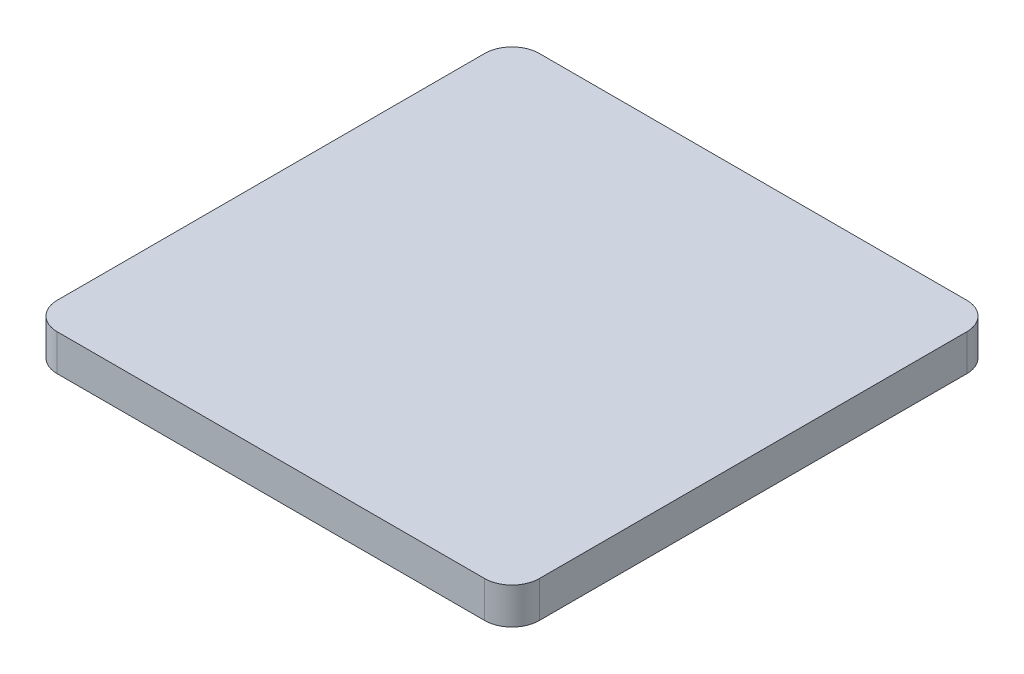
ISO-10303-21;
HEADER;
FILE_DESCRIPTION(('STEP AP214'),'2;1');
FILE_NAME('part.step','',(''),(''),'','','');
FILE_SCHEMA(('AUTOMOTIVE_DESIGN { 1 0 10303 214 1 1 1 1 }'));
ENDSEC;
DATA;
#1=APPLICATION_CONTEXT('core data for automotive mechanical design processes');
#2=APPLICATION_PROTOCOL_DEFINITION('international standard','automotive_design',2000,#1);
#3=PRODUCT_CONTEXT('',#1,'mechanical');
#4=PRODUCT('Part','Part','',(#3));
#5=PRODUCT_RELATED_PRODUCT_CATEGORY('part','',(#4));
#6=PRODUCT_DEFINITION_FORMATION('','',#4);
#7=PRODUCT_DEFINITION_CONTEXT('part definition',#1,'design');
#8=PRODUCT_DEFINITION('design','',#6,#7);
#9=PRODUCT_DEFINITION_SHAPE('','',#8);
#10=(LENGTH_UNIT() NAMED_UNIT(*) SI_UNIT(.MILLI.,.METRE.));
#11=(NAMED_UNIT(*) PLANE_ANGLE_UNIT() SI_UNIT($,.RADIAN.));
#12=(NAMED_UNIT(*) SI_UNIT($,.STERADIAN.) SOLID_ANGLE_UNIT());
#13=UNCERTAINTY_MEASURE_WITH_UNIT(LENGTH_MEASURE(1.E-05),#10,'distance_accuracy_value','');
#14=(GEOMETRIC_REPRESENTATION_CONTEXT(3) GLOBAL_UNCERTAINTY_ASSIGNED_CONTEXT((#13)) GLOBAL_UNIT_ASSIGNED_CONTEXT((#10,
#11,#12)) REPRESENTATION_CONTEXT('',''));
#15=CARTESIAN_POINT('',(0.,0.,0.));
#16=DIRECTION('',(0.,0.,1.));
#17=DIRECTION('',(1.,0.,0.));
#18=AXIS2_PLACEMENT_3D('',#15,#16,#17);
#19=CARTESIAN_POINT('',(0.,4.,0.));
#20=DIRECTION('',(1.,0.,0.));
#21=DIRECTION('',(0.,0.,-1.));
#22=AXIS2_PLACEMENT_3D('',#19,#20,#21);
#23=PLANE('',#22);
#24=DIRECTION('',(0.,0.,1.));
#25=VECTOR('',#24,1.);
#26=CARTESIAN_POINT('',(0.,4.,0.));
#27=LINE('',#26,#25);
#28=CARTESIAN_POINT('',(0.,4.,-50.));
#29=VERTEX_POINT('',#28);
#30=CARTESIAN_POINT('',(0.,4.,-3.));
#31=VERTEX_POINT('',#30);
#32=EDGE_CURVE('E118',#29,#31,#27,.T.);
#33=ORIENTED_EDGE('',*,*,#32,.F.);
#34=DIRECTION('',(0.,-1.,0.));
#35=VECTOR('',#34,1.);
#36=CARTESIAN_POINT('',(0.,4.,-50.));
#37=LINE('',#36,#35);
#38=CARTESIAN_POINT('',(0.,0.,-50.));
#39=VERTEX_POINT('',#38);
#40=EDGE_CURVE('E103',#29,#39,#37,.T.);
#41=ORIENTED_EDGE('',*,*,#40,.T.);
#42=DIRECTION('',(0.,0.,1.));
#43=VECTOR('',#42,1.);
#44=CARTESIAN_POINT('',(0.,0.,0.));
#45=LINE('',#44,#43);
#46=CARTESIAN_POINT('',(0.,0.,-3.));
#47=VERTEX_POINT('',#46);
#48=EDGE_CURVE('E115',#39,#47,#45,.T.);
#49=ORIENTED_EDGE('',*,*,#48,.T.);
#50=DIRECTION('',(0.,-1.,0.));
#51=VECTOR('',#50,1.);
#52=CARTESIAN_POINT('',(0.,4.,-3.));
#53=LINE('',#52,#51);
#54=EDGE_CURVE('E120',#47,#31,#53,.F.);
#55=ORIENTED_EDGE('',*,*,#54,.T.);
#56=EDGE_LOOP('',(#33,#41,#49,#55));
#57=FACE_BOUND('',#56,.T.);
#58=ADVANCED_FACE('F34',(#57),#23,.F.);
#59=CARTESIAN_POINT('',(0.,4.,0.));
#60=DIRECTION('',(0.,0.,-1.));
#61=DIRECTION('',(-1.,0.,0.));
#62=AXIS2_PLACEMENT_3D('',#59,#60,#61);
#63=PLANE('',#62);
#64=DIRECTION('',(1.,0.,0.));
#65=VECTOR('',#64,1.);
#66=CARTESIAN_POINT('',(0.,4.,0.));
#67=LINE('',#66,#65);
#68=CARTESIAN_POINT('',(3.,4.,0.));
#69=VERTEX_POINT('',#68);
#70=CARTESIAN_POINT('',(50.,4.,0.));
#71=VERTEX_POINT('',#70);
#72=EDGE_CURVE('E169',#69,#71,#67,.T.);
#73=ORIENTED_EDGE('',*,*,#72,.F.);
#74=DIRECTION('',(0.,-1.,0.));
#75=VECTOR('',#74,1.);
#76=CARTESIAN_POINT('',(3.,4.,0.));
#77=LINE('',#76,#75);
#78=CARTESIAN_POINT('',(3.,0.,0.));
#79=VERTEX_POINT('',#78);
#80=EDGE_CURVE('E153',#69,#79,#77,.T.);
#81=ORIENTED_EDGE('',*,*,#80,.T.);
#82=DIRECTION('',(1.,0.,0.));
#83=VECTOR('',#82,1.);
#84=CARTESIAN_POINT('',(0.,0.,0.));
#85=LINE('',#84,#83);
#86=CARTESIAN_POINT('',(50.,0.,0.));
#87=VERTEX_POINT('',#86);
#88=EDGE_CURVE('E124',#79,#87,#85,.T.);
#89=ORIENTED_EDGE('',*,*,#88,.T.);
#90=DIRECTION('',(0.,-1.,0.));
#91=VECTOR('',#90,1.);
#92=CARTESIAN_POINT('',(50.,4.,0.));
#93=LINE('',#92,#91);
#94=EDGE_CURVE('E151',#87,#71,#93,.F.);
#95=ORIENTED_EDGE('',*,*,#94,.T.);
#96=EDGE_LOOP('',(#73,#81,#89,#95));
#97=FACE_BOUND('',#96,.T.);
#98=ADVANCED_FACE('F179',(#97),#63,.F.);
#99=CARTESIAN_POINT('',(53.,4.,0.));
#100=DIRECTION('',(-1.,0.,0.));
#101=DIRECTION('',(0.,0.,1.));
#102=AXIS2_PLACEMENT_3D('',#99,#100,#101);
#103=PLANE('',#102);
#104=DIRECTION('',(0.,0.,-1.));
#105=VECTOR('',#104,1.);
#106=CARTESIAN_POINT('',(53.,0.,0.));
#107=LINE('',#106,#105);
#108=CARTESIAN_POINT('',(53.,0.,-3.));
#109=VERTEX_POINT('',#108);
#110=CARTESIAN_POINT('',(53.,0.,-50.));
#111=VERTEX_POINT('',#110);
#112=EDGE_CURVE('E127',#109,#111,#107,.T.);
#113=ORIENTED_EDGE('',*,*,#112,.T.);
#114=DIRECTION('',(0.,-1.,0.));
#115=VECTOR('',#114,1.);
#116=CARTESIAN_POINT('',(53.,4.,-50.));
#117=LINE('',#116,#115);
#118=CARTESIAN_POINT('',(53.,4.,-50.));
#119=VERTEX_POINT('',#118);
#120=EDGE_CURVE('E11',#111,#119,#117,.F.);
#121=ORIENTED_EDGE('',*,*,#120,.T.);
#122=DIRECTION('',(0.,0.,-1.));
#123=VECTOR('',#122,1.);
#124=CARTESIAN_POINT('',(53.,4.,0.));
#125=LINE('',#124,#123);
#126=CARTESIAN_POINT('',(53.,4.,-3.));
#127=VERTEX_POINT('',#126);
#128=EDGE_CURVE('E159',#127,#119,#125,.T.);
#129=ORIENTED_EDGE('',*,*,#128,.F.);
#130=DIRECTION('',(0.,-1.,0.));
#131=VECTOR('',#130,1.);
#132=CARTESIAN_POINT('',(53.,4.,-3.));
#133=LINE('',#132,#131);
#134=EDGE_CURVE('E42',#127,#109,#133,.T.);
#135=ORIENTED_EDGE('',*,*,#134,.T.);
#136=EDGE_LOOP('',(#113,#121,#129,#135));
#137=FACE_BOUND('',#136,.T.);
#138=ADVANCED_FACE('F158',(#137),#103,.F.);
#139=CARTESIAN_POINT('',(0.,4.,-53.));
#140=DIRECTION('',(0.,0.,1.));
#141=DIRECTION('',(1.,0.,0.));
#142=AXIS2_PLACEMENT_3D('',#139,#140,#141);
#143=PLANE('',#142);
#144=DIRECTION('',(-1.,0.,0.));
#145=VECTOR('',#144,1.);
#146=CARTESIAN_POINT('',(0.,0.,-53.));
#147=LINE('',#146,#145);
#148=CARTESIAN_POINT('',(50.,0.,-53.));
#149=VERTEX_POINT('',#148);
#150=CARTESIAN_POINT('',(2.99999999999999,0.,-53.));
#151=VERTEX_POINT('',#150);
#152=EDGE_CURVE('E134',#149,#151,#147,.T.);
#153=ORIENTED_EDGE('',*,*,#152,.T.);
#154=DIRECTION('',(0.,-1.,0.));
#155=VECTOR('',#154,1.);
#156=CARTESIAN_POINT('',(2.99999999999999,4.,-53.));
#157=LINE('',#156,#155);
#158=CARTESIAN_POINT('',(2.99999999999999,4.,-53.));
#159=VERTEX_POINT('',#158);
#160=EDGE_CURVE('E104',#151,#159,#157,.F.);
#161=ORIENTED_EDGE('',*,*,#160,.T.);
#162=DIRECTION('',(-1.,0.,0.));
#163=VECTOR('',#162,1.);
#164=CARTESIAN_POINT('',(0.,4.,-53.));
#165=LINE('',#164,#163);
#166=CARTESIAN_POINT('',(50.,4.,-53.));
#167=VERTEX_POINT('',#166);
#168=EDGE_CURVE('E130',#167,#159,#165,.T.);
#169=ORIENTED_EDGE('',*,*,#168,.F.);
#170=DIRECTION('',(0.,-1.,0.));
#171=VECTOR('',#170,1.);
#172=CARTESIAN_POINT('',(50.,4.,-53.));
#173=LINE('',#172,#171);
#174=EDGE_CURVE('E109',#167,#149,#173,.T.);
#175=ORIENTED_EDGE('',*,*,#174,.T.);
#176=EDGE_LOOP('',(#153,#161,#169,#175));
#177=FACE_BOUND('',#176,.T.);
#178=ADVANCED_FACE('F167',(#177),#143,.F.);
#179=CARTESIAN_POINT('',(0.,4.,0.));
#180=DIRECTION('',(0.,-1.,0.));
#181=DIRECTION('',(0.,0.,-1.));
#182=AXIS2_PLACEMENT_3D('',#179,#180,#181);
#183=PLANE('',#182);
#184=ORIENTED_EDGE('',*,*,#168,.T.);
#185=CARTESIAN_POINT('',(2.99999999999999,4.,-50.));
#186=DIRECTION('',(0.,-1.,0.));
#187=DIRECTION('',(0.,0.,-1.));
#188=AXIS2_PLACEMENT_3D('',#185,#186,#187);
#189=CIRCLE('',#188,3.);
#190=EDGE_CURVE('E149',#159,#29,#189,.F.);
#191=ORIENTED_EDGE('',*,*,#190,.T.);
#192=ORIENTED_EDGE('',*,*,#32,.T.);
#193=CARTESIAN_POINT('',(3.,4.,-3.));
#194=DIRECTION('',(0.,-1.,0.));
#195=DIRECTION('',(0.,0.,-1.));
#196=AXIS2_PLACEMENT_3D('',#193,#194,#195);
#197=CIRCLE('',#196,3.);
#198=EDGE_CURVE('E147',#31,#69,#197,.F.);
#199=ORIENTED_EDGE('',*,*,#198,.T.);
#200=ORIENTED_EDGE('',*,*,#72,.T.);
#201=CARTESIAN_POINT('',(50.,4.,-3.));
#202=DIRECTION('',(0.,-1.,0.));
#203=DIRECTION('',(0.,0.,-1.));
#204=AXIS2_PLACEMENT_3D('',#201,#202,#203);
#205=CIRCLE('',#204,3.);
#206=EDGE_CURVE('E54',#71,#127,#205,.F.);
#207=ORIENTED_EDGE('',*,*,#206,.T.);
#208=ORIENTED_EDGE('',*,*,#128,.T.);
#209=CARTESIAN_POINT('',(50.,4.,-50.));
#210=DIRECTION('',(0.,-1.,0.));
#211=DIRECTION('',(0.,0.,-1.));
#212=AXIS2_PLACEMENT_3D('',#209,#210,#211);
#213=CIRCLE('',#212,3.);
#214=EDGE_CURVE('E145',#119,#167,#213,.F.);
#215=ORIENTED_EDGE('',*,*,#214,.T.);
#216=EDGE_LOOP('',(#184,#191,#192,#199,#200,#207,#208,#215));
#217=FACE_BOUND('',#216,.T.);
#218=ADVANCED_FACE('F173',(#217),#183,.F.);
#219=CARTESIAN_POINT('',(0.,0.,0.));
#220=DIRECTION('',(0.,-1.,0.));
#221=DIRECTION('',(0.,0.,-1.));
#222=AXIS2_PLACEMENT_3D('',#219,#220,#221);
#223=PLANE('',#222);
#224=ORIENTED_EDGE('',*,*,#48,.F.);
#225=CARTESIAN_POINT('',(2.99999999999999,0.,-50.));
#226=DIRECTION('',(0.,-1.,0.));
#227=DIRECTION('',(0.,0.,-1.));
#228=AXIS2_PLACEMENT_3D('',#225,#226,#227);
#229=CIRCLE('',#228,3.);
#230=EDGE_CURVE('E99',#39,#151,#229,.T.);
#231=ORIENTED_EDGE('',*,*,#230,.T.);
#232=ORIENTED_EDGE('',*,*,#152,.F.);
#233=CARTESIAN_POINT('',(50.,0.,-50.));
#234=DIRECTION('',(0.,-1.,0.));
#235=DIRECTION('',(0.,0.,-1.));
#236=AXIS2_PLACEMENT_3D('',#233,#234,#235);
#237=CIRCLE('',#236,3.);
#238=EDGE_CURVE('E138',#149,#111,#237,.T.);
#239=ORIENTED_EDGE('',*,*,#238,.T.);
#240=ORIENTED_EDGE('',*,*,#112,.F.);
#241=CARTESIAN_POINT('',(50.,0.,-3.));
#242=DIRECTION('',(0.,-1.,0.));
#243=DIRECTION('',(0.,0.,-1.));
#244=AXIS2_PLACEMENT_3D('',#241,#242,#243);
#245=CIRCLE('',#244,3.);
#246=EDGE_CURVE('E119',#109,#87,#245,.T.);
#247=ORIENTED_EDGE('',*,*,#246,.T.);
#248=ORIENTED_EDGE('',*,*,#88,.F.);
#249=CARTESIAN_POINT('',(3.,0.,-3.));
#250=DIRECTION('',(0.,-1.,0.));
#251=DIRECTION('',(0.,0.,-1.));
#252=AXIS2_PLACEMENT_3D('',#249,#250,#251);
#253=CIRCLE('',#252,3.);
#254=EDGE_CURVE('E110',#79,#47,#253,.T.);
#255=ORIENTED_EDGE('',*,*,#254,.T.);
#256=EDGE_LOOP('',(#224,#231,#232,#239,#240,#247,#248,#255));
#257=FACE_BOUND('',#256,.T.);
#258=ADVANCED_FACE('F122',(#257),#223,.T.);
#259=CARTESIAN_POINT('',(2.99999999999999,4.,-50.));
#260=DIRECTION('',(0.,-1.,0.));
#261=DIRECTION('',(0.,0.,-1.));
#262=AXIS2_PLACEMENT_3D('',#259,#260,#261);
#263=CYLINDRICAL_SURFACE('',#262,3.);
#264=ORIENTED_EDGE('',*,*,#190,.F.);
#265=ORIENTED_EDGE('',*,*,#160,.F.);
#266=ORIENTED_EDGE('',*,*,#230,.F.);
#267=ORIENTED_EDGE('',*,*,#40,.F.);
#268=EDGE_LOOP('',(#264,#265,#266,#267));
#269=FACE_BOUND('',#268,.T.);
#270=ADVANCED_FACE('F102',(#269),#263,.T.);
#271=CARTESIAN_POINT('',(3.,4.,-3.));
#272=DIRECTION('',(0.,-1.,0.));
#273=DIRECTION('',(0.,0.,-1.));
#274=AXIS2_PLACEMENT_3D('',#271,#272,#273);
#275=CYLINDRICAL_SURFACE('',#274,3.);
#276=ORIENTED_EDGE('',*,*,#198,.F.);
#277=ORIENTED_EDGE('',*,*,#54,.F.);
#278=ORIENTED_EDGE('',*,*,#254,.F.);
#279=ORIENTED_EDGE('',*,*,#80,.F.);
#280=EDGE_LOOP('',(#276,#277,#278,#279));
#281=FACE_BOUND('',#280,.T.);
#282=ADVANCED_FACE('F177',(#281),#275,.T.);
#283=CARTESIAN_POINT('',(50.,4.,-50.));
#284=DIRECTION('',(0.,-1.,0.));
#285=DIRECTION('',(0.,0.,-1.));
#286=AXIS2_PLACEMENT_3D('',#283,#284,#285);
#287=CYLINDRICAL_SURFACE('',#286,3.);
#288=ORIENTED_EDGE('',*,*,#214,.F.);
#289=ORIENTED_EDGE('',*,*,#120,.F.);
#290=ORIENTED_EDGE('',*,*,#238,.F.);
#291=ORIENTED_EDGE('',*,*,#174,.F.);
#292=EDGE_LOOP('',(#288,#289,#290,#291));
#293=FACE_BOUND('',#292,.T.);
#294=ADVANCED_FACE('F164',(#293),#287,.T.);
#295=CARTESIAN_POINT('',(50.,4.,-3.));
#296=DIRECTION('',(0.,-1.,0.));
#297=DIRECTION('',(0.,0.,-1.));
#298=AXIS2_PLACEMENT_3D('',#295,#296,#297);
#299=CYLINDRICAL_SURFACE('',#298,3.);
#300=ORIENTED_EDGE('',*,*,#206,.F.);
#301=ORIENTED_EDGE('',*,*,#94,.F.);
#302=ORIENTED_EDGE('',*,*,#246,.F.);
#303=ORIENTED_EDGE('',*,*,#134,.F.);
#304=EDGE_LOOP('',(#300,#301,#302,#303));
#305=FACE_BOUND('',#304,.T.);
#306=ADVANCED_FACE('F36',(#305),#299,.T.);
#307=CLOSED_SHELL('',(#58,#98,#138,#178,#218,#258,#270,#282,#294,#306));
#308=MANIFOLD_SOLID_BREP('B2',#307);
#309=ADVANCED_BREP_SHAPE_REPRESENTATION('',(#18,#308),#14);
#310=SHAPE_DEFINITION_REPRESENTATION(#9,#309);
ENDSEC;
END-ISO-10303-21;
